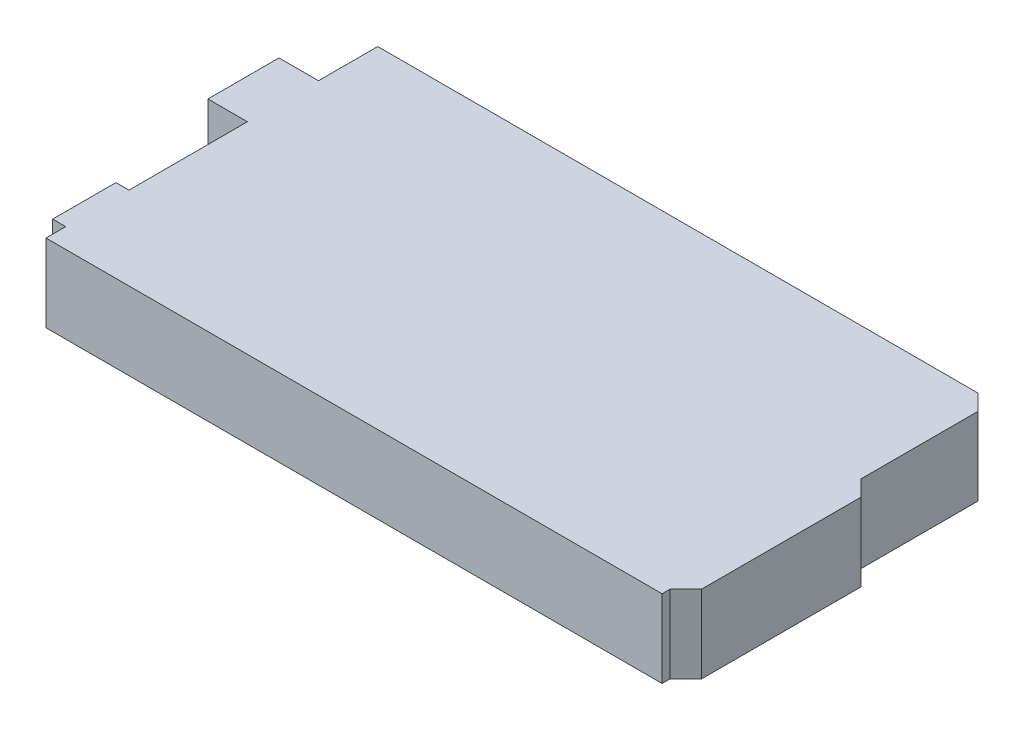
ISO-10303-21;
HEADER;
FILE_DESCRIPTION(('STEP AP214'),'2;1');
FILE_NAME('part.step','',(''),(''),'','','');
FILE_SCHEMA(('AUTOMOTIVE_DESIGN { 1 0 10303 214 1 1 1 1 }'));
ENDSEC;
DATA;
#1=APPLICATION_CONTEXT('core data for automotive mechanical design processes');
#2=APPLICATION_PROTOCOL_DEFINITION('international standard','automotive_design',2000,#1);
#3=PRODUCT_CONTEXT('',#1,'mechanical');
#4=PRODUCT('Part','Part','',(#3));
#5=PRODUCT_RELATED_PRODUCT_CATEGORY('part','',(#4));
#6=PRODUCT_DEFINITION_FORMATION('','',#4);
#7=PRODUCT_DEFINITION_CONTEXT('part definition',#1,'design');
#8=PRODUCT_DEFINITION('design','',#6,#7);
#9=PRODUCT_DEFINITION_SHAPE('','',#8);
#10=(LENGTH_UNIT() NAMED_UNIT(*) SI_UNIT(.MILLI.,.METRE.));
#11=(NAMED_UNIT(*) PLANE_ANGLE_UNIT() SI_UNIT($,.RADIAN.));
#12=(NAMED_UNIT(*) SI_UNIT($,.STERADIAN.) SOLID_ANGLE_UNIT());
#13=UNCERTAINTY_MEASURE_WITH_UNIT(LENGTH_MEASURE(1.E-05),#10,'distance_accuracy_value','');
#14=(GEOMETRIC_REPRESENTATION_CONTEXT(3) GLOBAL_UNCERTAINTY_ASSIGNED_CONTEXT((#13)) GLOBAL_UNIT_ASSIGNED_CONTEXT((#10,
#11,#12)) REPRESENTATION_CONTEXT('',''));
#15=CARTESIAN_POINT('',(0.,0.,0.));
#16=DIRECTION('',(0.,0.,1.));
#17=DIRECTION('',(1.,0.,0.));
#18=AXIS2_PLACEMENT_3D('',#15,#16,#17);
#19=CARTESIAN_POINT('',(-19.7989743589743,12.5,25.5953846153846));
#20=DIRECTION('',(0.,0.,-1.));
#21=DIRECTION('',(-1.,0.,0.));
#22=AXIS2_PLACEMENT_3D('',#19,#20,#21);
#23=PLANE('',#22);
#24=DIRECTION('',(1.,0.,0.));
#25=VECTOR('',#24,1.);
#26=CARTESIAN_POINT('',(-19.7989743589743,0.,25.5953846153846));
#27=LINE('',#26,#25);
#28=CARTESIAN_POINT('',(-118.858974358974,0.,25.5953846153846));
#29=VERTEX_POINT('',#28);
#30=CARTESIAN_POINT('',(-19.7989743589743,0.,25.5953846153846));
#31=VERTEX_POINT('',#30);
#32=EDGE_CURVE('E183',#29,#31,#27,.T.);
#33=ORIENTED_EDGE('',*,*,#32,.T.);
#34=DIRECTION('',(0.,-1.,0.));
#35=VECTOR('',#34,1.);
#36=CARTESIAN_POINT('',(-19.7989743589743,12.5,25.5953846153846));
#37=LINE('',#36,#35);
#38=CARTESIAN_POINT('',(-19.7989743589743,12.5,25.5953846153846));
#39=VERTEX_POINT('',#38);
#40=EDGE_CURVE('E11',#39,#31,#37,.T.);
#41=ORIENTED_EDGE('',*,*,#40,.F.);
#42=DIRECTION('',(1.,0.,0.));
#43=VECTOR('',#42,1.);
#44=CARTESIAN_POINT('',(-19.7989743589743,12.5,25.5953846153846));
#45=LINE('',#44,#43);
#46=CARTESIAN_POINT('',(-118.858974358974,12.5,25.5953846153846));
#47=VERTEX_POINT('',#46);
#48=EDGE_CURVE('E215',#47,#39,#45,.T.);
#49=ORIENTED_EDGE('',*,*,#48,.F.);
#50=DIRECTION('',(0.,-1.,0.));
#51=VECTOR('',#50,1.);
#52=CARTESIAN_POINT('',(-118.858974358974,12.5,25.5953846153846));
#53=LINE('',#52,#51);
#54=EDGE_CURVE('E179',#47,#29,#53,.T.);
#55=ORIENTED_EDGE('',*,*,#54,.T.);
#56=EDGE_LOOP('',(#33,#41,#49,#55));
#57=FACE_BOUND('',#56,.T.);
#58=ADVANCED_FACE('F33',(#57),#23,.F.);
#59=CARTESIAN_POINT('',(-19.7989743589743,12.5,24.3253846153846));
#60=DIRECTION('',(-1.,0.,0.));
#61=DIRECTION('',(0.,0.,1.));
#62=AXIS2_PLACEMENT_3D('',#59,#60,#61);
#63=PLANE('',#62);
#64=DIRECTION('',(0.,0.,-1.));
#65=VECTOR('',#64,1.);
#66=CARTESIAN_POINT('',(-19.7989743589743,0.,24.3253846153846));
#67=LINE('',#66,#65);
#68=CARTESIAN_POINT('',(-19.7989743589743,0.,24.3253846153846));
#69=VERTEX_POINT('',#68);
#70=EDGE_CURVE('E186',#31,#69,#67,.T.);
#71=ORIENTED_EDGE('',*,*,#70,.T.);
#72=DIRECTION('',(0.,-1.,0.));
#73=VECTOR('',#72,1.);
#74=CARTESIAN_POINT('',(-19.7989743589743,12.5,24.3253846153846));
#75=LINE('',#74,#73);
#76=CARTESIAN_POINT('',(-19.7989743589743,12.5,24.3253846153846));
#77=VERTEX_POINT('',#76);
#78=EDGE_CURVE('E41',#77,#69,#75,.T.);
#79=ORIENTED_EDGE('',*,*,#78,.F.);
#80=DIRECTION('',(0.,0.,-1.));
#81=VECTOR('',#80,1.);
#82=CARTESIAN_POINT('',(-19.7989743589743,12.5,24.3253846153846));
#83=LINE('',#82,#81);
#84=EDGE_CURVE('E119',#39,#77,#83,.T.);
#85=ORIENTED_EDGE('',*,*,#84,.F.);
#86=ORIENTED_EDGE('',*,*,#40,.T.);
#87=EDGE_LOOP('',(#71,#79,#85,#86));
#88=FACE_BOUND('',#87,.T.);
#89=ADVANCED_FACE('F318',(#88),#63,.F.);
#90=CARTESIAN_POINT('',(-17.2589743589743,12.5,21.7853846153846));
#91=DIRECTION('',(-0.707106781186547,0.,-0.707106781186547));
#92=DIRECTION('',(-0.707106781186548,0.,0.707106781186548));
#93=AXIS2_PLACEMENT_3D('',#90,#91,#92);
#94=PLANE('',#93);
#95=DIRECTION('',(0.707106781186547,0.,-0.707106781186547));
#96=VECTOR('',#95,1.);
#97=CARTESIAN_POINT('',(-17.2589743589743,0.,21.7853846153846));
#98=LINE('',#97,#96);
#99=CARTESIAN_POINT('',(-17.2589743589743,0.,21.7853846153846));
#100=VERTEX_POINT('',#99);
#101=EDGE_CURVE('E188',#69,#100,#98,.T.);
#102=ORIENTED_EDGE('',*,*,#101,.T.);
#103=DIRECTION('',(0.,-1.,0.));
#104=VECTOR('',#103,1.);
#105=CARTESIAN_POINT('',(-17.2589743589743,12.5,21.7853846153846));
#106=LINE('',#105,#104);
#107=CARTESIAN_POINT('',(-17.2589743589743,12.5,21.7853846153846));
#108=VERTEX_POINT('',#107);
#109=EDGE_CURVE('E249',#108,#100,#106,.T.);
#110=ORIENTED_EDGE('',*,*,#109,.F.);
#111=DIRECTION('',(0.707106781186547,0.,-0.707106781186547));
#112=VECTOR('',#111,1.);
#113=CARTESIAN_POINT('',(-17.2589743589743,12.5,21.7853846153846));
#114=LINE('',#113,#112);
#115=EDGE_CURVE('E257',#77,#108,#114,.T.);
#116=ORIENTED_EDGE('',*,*,#115,.F.);
#117=ORIENTED_EDGE('',*,*,#78,.T.);
#118=EDGE_LOOP('',(#102,#110,#116,#117));
#119=FACE_BOUND('',#118,.T.);
#120=ADVANCED_FACE('F255',(#119),#94,.F.);
#121=CARTESIAN_POINT('',(-17.2589743589743,12.5,-3.8425641025641));
#122=DIRECTION('',(-1.,0.,0.));
#123=DIRECTION('',(0.,0.,1.));
#124=AXIS2_PLACEMENT_3D('',#121,#122,#123);
#125=PLANE('',#124);
#126=DIRECTION('',(0.,0.,-1.));
#127=VECTOR('',#126,1.);
#128=CARTESIAN_POINT('',(-17.2589743589743,0.,-3.8425641025641));
#129=LINE('',#128,#127);
#130=CARTESIAN_POINT('',(-17.2589743589743,0.,-3.8425641025641));
#131=VERTEX_POINT('',#130);
#132=EDGE_CURVE('E190',#100,#131,#129,.T.);
#133=ORIENTED_EDGE('',*,*,#132,.T.);
#134=DIRECTION('',(0.,-1.,0.));
#135=VECTOR('',#134,1.);
#136=CARTESIAN_POINT('',(-17.2589743589743,12.5,-3.8425641025641));
#137=LINE('',#136,#135);
#138=CARTESIAN_POINT('',(-17.2589743589743,12.5,-3.8425641025641));
#139=VERTEX_POINT('',#138);
#140=EDGE_CURVE('E246',#139,#131,#137,.T.);
#141=ORIENTED_EDGE('',*,*,#140,.F.);
#142=DIRECTION('',(0.,0.,-1.));
#143=VECTOR('',#142,1.);
#144=CARTESIAN_POINT('',(-17.2589743589743,12.5,-3.8425641025641));
#145=LINE('',#144,#143);
#146=EDGE_CURVE('E275',#108,#139,#145,.T.);
#147=ORIENTED_EDGE('',*,*,#146,.F.);
#148=ORIENTED_EDGE('',*,*,#109,.T.);
#149=EDGE_LOOP('',(#133,#141,#147,#148));
#150=FACE_BOUND('',#149,.T.);
#151=ADVANCED_FACE('F266',(#150),#125,.F.);
#152=CARTESIAN_POINT('',(-19.7989743589743,12.5,-6.3825641025641));
#153=DIRECTION('',(-0.707106781186547,0.,0.707106781186548));
#154=DIRECTION('',(0.707106781186548,0.,0.707106781186547));
#155=AXIS2_PLACEMENT_3D('',#152,#153,#154);
#156=PLANE('',#155);
#157=DIRECTION('',(-0.707106781186548,0.,-0.707106781186547));
#158=VECTOR('',#157,1.);
#159=CARTESIAN_POINT('',(-19.7989743589743,0.,-6.3825641025641));
#160=LINE('',#159,#158);
#161=CARTESIAN_POINT('',(-19.7989743589743,0.,-6.3825641025641));
#162=VERTEX_POINT('',#161);
#163=EDGE_CURVE('E192',#131,#162,#160,.T.);
#164=ORIENTED_EDGE('',*,*,#163,.T.);
#165=DIRECTION('',(0.,-1.,0.));
#166=VECTOR('',#165,1.);
#167=CARTESIAN_POINT('',(-19.7989743589743,12.5,-6.3825641025641));
#168=LINE('',#167,#166);
#169=CARTESIAN_POINT('',(-19.7989743589743,12.5,-6.3825641025641));
#170=VERTEX_POINT('',#169);
#171=EDGE_CURVE('E243',#170,#162,#168,.T.);
#172=ORIENTED_EDGE('',*,*,#171,.F.);
#173=DIRECTION('',(-0.707106781186548,0.,-0.707106781186547));
#174=VECTOR('',#173,1.);
#175=CARTESIAN_POINT('',(-19.7989743589743,12.5,-6.3825641025641));
#176=LINE('',#175,#174);
#177=EDGE_CURVE('E272',#139,#170,#176,.T.);
#178=ORIENTED_EDGE('',*,*,#177,.F.);
#179=ORIENTED_EDGE('',*,*,#140,.T.);
#180=EDGE_LOOP('',(#164,#172,#178,#179));
#181=FACE_BOUND('',#180,.T.);
#182=ADVANCED_FACE('F270',(#181),#156,.F.);
#183=CARTESIAN_POINT('',(-19.7989743589743,12.5,-25.2046153846154));
#184=DIRECTION('',(-1.,0.,0.));
#185=DIRECTION('',(0.,0.,1.));
#186=AXIS2_PLACEMENT_3D('',#183,#184,#185);
#187=PLANE('',#186);
#188=DIRECTION('',(0.,0.,-1.));
#189=VECTOR('',#188,1.);
#190=CARTESIAN_POINT('',(-19.7989743589743,0.,-25.2046153846154));
#191=LINE('',#190,#189);
#192=CARTESIAN_POINT('',(-19.7989743589743,0.,-25.2046153846154));
#193=VERTEX_POINT('',#192);
#194=EDGE_CURVE('E194',#162,#193,#191,.T.);
#195=ORIENTED_EDGE('',*,*,#194,.T.);
#196=DIRECTION('',(0.,-1.,0.));
#197=VECTOR('',#196,1.);
#198=CARTESIAN_POINT('',(-19.7989743589743,12.5,-25.2046153846154));
#199=LINE('',#198,#197);
#200=CARTESIAN_POINT('',(-19.7989743589743,12.5,-25.2046153846154));
#201=VERTEX_POINT('',#200);
#202=EDGE_CURVE('E240',#201,#193,#199,.T.);
#203=ORIENTED_EDGE('',*,*,#202,.F.);
#204=DIRECTION('',(0.,0.,-1.));
#205=VECTOR('',#204,1.);
#206=CARTESIAN_POINT('',(-19.7989743589743,12.5,-25.2046153846154));
#207=LINE('',#206,#205);
#208=EDGE_CURVE('E274',#170,#201,#207,.T.);
#209=ORIENTED_EDGE('',*,*,#208,.F.);
#210=ORIENTED_EDGE('',*,*,#171,.T.);
#211=EDGE_LOOP('',(#195,#203,#209,#210));
#212=FACE_BOUND('',#211,.T.);
#213=ADVANCED_FACE('F331',(#212),#187,.F.);
#214=CARTESIAN_POINT('',(-22.3389743589743,12.5,-27.7446153846154));
#215=DIRECTION('',(-0.707106781186548,0.,0.707106781186547));
#216=DIRECTION('',(0.707106781186547,0.,0.707106781186548));
#217=AXIS2_PLACEMENT_3D('',#214,#215,#216);
#218=PLANE('',#217);
#219=DIRECTION('',(-0.707106781186547,0.,-0.707106781186548));
#220=VECTOR('',#219,1.);
#221=CARTESIAN_POINT('',(-22.3389743589743,0.,-27.7446153846154));
#222=LINE('',#221,#220);
#223=CARTESIAN_POINT('',(-22.3389743589743,0.,-27.7446153846154));
#224=VERTEX_POINT('',#223);
#225=EDGE_CURVE('E196',#193,#224,#222,.T.);
#226=ORIENTED_EDGE('',*,*,#225,.T.);
#227=DIRECTION('',(0.,-1.,0.));
#228=VECTOR('',#227,1.);
#229=CARTESIAN_POINT('',(-22.3389743589743,12.5,-27.7446153846154));
#230=LINE('',#229,#228);
#231=CARTESIAN_POINT('',(-22.3389743589743,12.5,-27.7446153846154));
#232=VERTEX_POINT('',#231);
#233=EDGE_CURVE('E237',#232,#224,#230,.T.);
#234=ORIENTED_EDGE('',*,*,#233,.F.);
#235=DIRECTION('',(-0.707106781186547,0.,-0.707106781186548));
#236=VECTOR('',#235,1.);
#237=CARTESIAN_POINT('',(-22.3389743589743,12.5,-27.7446153846154));
#238=LINE('',#237,#236);
#239=EDGE_CURVE('E277',#201,#232,#238,.T.);
#240=ORIENTED_EDGE('',*,*,#239,.F.);
#241=ORIENTED_EDGE('',*,*,#202,.T.);
#242=EDGE_LOOP('',(#226,#234,#240,#241));
#243=FACE_BOUND('',#242,.T.);
#244=ADVANCED_FACE('F334',(#243),#218,.F.);
#245=CARTESIAN_POINT('',(-118.858974358974,12.5,-27.7446153846154));
#246=DIRECTION('',(0.,0.,1.));
#247=DIRECTION('',(1.,0.,0.));
#248=AXIS2_PLACEMENT_3D('',#245,#246,#247);
#249=PLANE('',#248);
#250=DIRECTION('',(-1.,0.,0.));
#251=VECTOR('',#250,1.);
#252=CARTESIAN_POINT('',(-118.858974358974,0.,-27.7446153846154));
#253=LINE('',#252,#251);
#254=CARTESIAN_POINT('',(-118.858974358974,0.,-27.7446153846154));
#255=VERTEX_POINT('',#254);
#256=EDGE_CURVE('E198',#224,#255,#253,.T.);
#257=ORIENTED_EDGE('',*,*,#256,.T.);
#258=DIRECTION('',(0.,-1.,0.));
#259=VECTOR('',#258,1.);
#260=CARTESIAN_POINT('',(-118.858974358974,12.5,-27.7446153846154));
#261=LINE('',#260,#259);
#262=CARTESIAN_POINT('',(-118.858974358974,12.5,-27.7446153846154));
#263=VERTEX_POINT('',#262);
#264=EDGE_CURVE('E234',#263,#255,#261,.T.);
#265=ORIENTED_EDGE('',*,*,#264,.F.);
#266=DIRECTION('',(-1.,0.,0.));
#267=VECTOR('',#266,1.);
#268=CARTESIAN_POINT('',(-118.858974358974,12.5,-27.7446153846154));
#269=LINE('',#268,#267);
#270=EDGE_CURVE('E283',#232,#263,#269,.T.);
#271=ORIENTED_EDGE('',*,*,#270,.F.);
#272=ORIENTED_EDGE('',*,*,#233,.T.);
#273=EDGE_LOOP('',(#257,#265,#271,#272));
#274=FACE_BOUND('',#273,.T.);
#275=ADVANCED_FACE('F338',(#274),#249,.F.);
#276=CARTESIAN_POINT('',(-118.858974358974,12.5,-18.2196153846154));
#277=DIRECTION('',(1.,0.,0.));
#278=DIRECTION('',(0.,0.,-1.));
#279=AXIS2_PLACEMENT_3D('',#276,#277,#278);
#280=PLANE('',#279);
#281=DIRECTION('',(0.,0.,1.));
#282=VECTOR('',#281,1.);
#283=CARTESIAN_POINT('',(-118.858974358974,0.,-18.2196153846154));
#284=LINE('',#283,#282);
#285=CARTESIAN_POINT('',(-118.858974358974,0.,-18.2196153846154));
#286=VERTEX_POINT('',#285);
#287=EDGE_CURVE('E200',#255,#286,#284,.T.);
#288=ORIENTED_EDGE('',*,*,#287,.T.);
#289=DIRECTION('',(0.,-1.,0.));
#290=VECTOR('',#289,1.);
#291=CARTESIAN_POINT('',(-118.858974358974,12.5,-18.2196153846154));
#292=LINE('',#291,#290);
#293=CARTESIAN_POINT('',(-118.858974358974,12.5,-18.2196153846154));
#294=VERTEX_POINT('',#293);
#295=EDGE_CURVE('E231',#294,#286,#292,.T.);
#296=ORIENTED_EDGE('',*,*,#295,.F.);
#297=DIRECTION('',(0.,0.,1.));
#298=VECTOR('',#297,1.);
#299=CARTESIAN_POINT('',(-118.858974358974,12.5,-18.2196153846154));
#300=LINE('',#299,#298);
#301=EDGE_CURVE('E285',#263,#294,#300,.T.);
#302=ORIENTED_EDGE('',*,*,#301,.F.);
#303=ORIENTED_EDGE('',*,*,#264,.T.);
#304=EDGE_LOOP('',(#288,#296,#302,#303));
#305=FACE_BOUND('',#304,.T.);
#306=ADVANCED_FACE('F342',(#305),#280,.F.);
#307=CARTESIAN_POINT('',(-118.858974358974,12.5,-18.2196153846154));
#308=DIRECTION('',(0.,0.,1.));
#309=DIRECTION('',(1.,0.,0.));
#310=AXIS2_PLACEMENT_3D('',#307,#308,#309);
#311=PLANE('',#310);
#312=DIRECTION('',(-1.,0.,0.));
#313=VECTOR('',#312,1.);
#314=CARTESIAN_POINT('',(-118.858974358974,0.,-18.2196153846154));
#315=LINE('',#314,#313);
#316=CARTESIAN_POINT('',(-125.208974358974,0.,-18.2196153846154));
#317=VERTEX_POINT('',#316);
#318=EDGE_CURVE('E202',#286,#317,#315,.T.);
#319=ORIENTED_EDGE('',*,*,#318,.T.);
#320=DIRECTION('',(0.,-1.,0.));
#321=VECTOR('',#320,1.);
#322=CARTESIAN_POINT('',(-125.208974358974,12.5,-18.2196153846154));
#323=LINE('',#322,#321);
#324=CARTESIAN_POINT('',(-125.208974358974,12.5,-18.2196153846154));
#325=VERTEX_POINT('',#324);
#326=EDGE_CURVE('E228',#325,#317,#323,.T.);
#327=ORIENTED_EDGE('',*,*,#326,.F.);
#328=DIRECTION('',(-1.,0.,0.));
#329=VECTOR('',#328,1.);
#330=CARTESIAN_POINT('',(-118.858974358974,12.5,-18.2196153846154));
#331=LINE('',#330,#329);
#332=EDGE_CURVE('E287',#294,#325,#331,.T.);
#333=ORIENTED_EDGE('',*,*,#332,.F.);
#334=ORIENTED_EDGE('',*,*,#295,.T.);
#335=EDGE_LOOP('',(#319,#327,#333,#334));
#336=FACE_BOUND('',#335,.T.);
#337=ADVANCED_FACE('F346',(#336),#311,.F.);
#338=CARTESIAN_POINT('',(-125.208974358974,12.5,-18.2196153846154));
#339=DIRECTION('',(1.,0.,0.));
#340=DIRECTION('',(0.,0.,-1.));
#341=AXIS2_PLACEMENT_3D('',#338,#339,#340);
#342=PLANE('',#341);
#343=DIRECTION('',(0.,0.,1.));
#344=VECTOR('',#343,1.);
#345=CARTESIAN_POINT('',(-125.208974358974,0.,-18.2196153846154));
#346=LINE('',#345,#344);
#347=CARTESIAN_POINT('',(-125.208974358974,0.,-6.78961538461537));
#348=VERTEX_POINT('',#347);
#349=EDGE_CURVE('E204',#317,#348,#346,.T.);
#350=ORIENTED_EDGE('',*,*,#349,.T.);
#351=DIRECTION('',(0.,-1.,0.));
#352=VECTOR('',#351,1.);
#353=CARTESIAN_POINT('',(-125.208974358974,12.5,-6.78961538461537));
#354=LINE('',#353,#352);
#355=CARTESIAN_POINT('',(-125.208974358974,12.5,-6.78961538461537));
#356=VERTEX_POINT('',#355);
#357=EDGE_CURVE('E225',#356,#348,#354,.T.);
#358=ORIENTED_EDGE('',*,*,#357,.F.);
#359=DIRECTION('',(0.,0.,1.));
#360=VECTOR('',#359,1.);
#361=CARTESIAN_POINT('',(-125.208974358974,12.5,-18.2196153846154));
#362=LINE('',#361,#360);
#363=EDGE_CURVE('E289',#325,#356,#362,.T.);
#364=ORIENTED_EDGE('',*,*,#363,.F.);
#365=ORIENTED_EDGE('',*,*,#326,.T.);
#366=EDGE_LOOP('',(#350,#358,#364,#365));
#367=FACE_BOUND('',#366,.T.);
#368=ADVANCED_FACE('F350',(#367),#342,.F.);
#369=CARTESIAN_POINT('',(-125.208974358974,12.5,-6.78961538461537));
#370=DIRECTION('',(0.,0.,-1.));
#371=DIRECTION('',(-1.,0.,0.));
#372=AXIS2_PLACEMENT_3D('',#369,#370,#371);
#373=PLANE('',#372);
#374=DIRECTION('',(1.,0.,0.));
#375=VECTOR('',#374,1.);
#376=CARTESIAN_POINT('',(-125.208974358974,0.,-6.78961538461537));
#377=LINE('',#376,#375);
#378=CARTESIAN_POINT('',(-118.858974358974,0.,-6.78961538461537));
#379=VERTEX_POINT('',#378);
#380=EDGE_CURVE('E206',#348,#379,#377,.T.);
#381=ORIENTED_EDGE('',*,*,#380,.T.);
#382=DIRECTION('',(0.,-1.,0.));
#383=VECTOR('',#382,1.);
#384=CARTESIAN_POINT('',(-118.858974358974,12.5,-6.78961538461537));
#385=LINE('',#384,#383);
#386=CARTESIAN_POINT('',(-118.858974358974,12.5,-6.78961538461537));
#387=VERTEX_POINT('',#386);
#388=EDGE_CURVE('E222',#387,#379,#385,.T.);
#389=ORIENTED_EDGE('',*,*,#388,.F.);
#390=DIRECTION('',(1.,0.,0.));
#391=VECTOR('',#390,1.);
#392=CARTESIAN_POINT('',(-125.208974358974,12.5,-6.78961538461537));
#393=LINE('',#392,#391);
#394=EDGE_CURVE('E291',#356,#387,#393,.T.);
#395=ORIENTED_EDGE('',*,*,#394,.F.);
#396=ORIENTED_EDGE('',*,*,#357,.T.);
#397=EDGE_LOOP('',(#381,#389,#395,#396));
#398=FACE_BOUND('',#397,.T.);
#399=ADVANCED_FACE('F354',(#398),#373,.F.);
#400=CARTESIAN_POINT('',(-118.858974358974,12.5,12.2603846153846));
#401=DIRECTION('',(1.,0.,0.));
#402=DIRECTION('',(0.,0.,-1.));
#403=AXIS2_PLACEMENT_3D('',#400,#401,#402);
#404=PLANE('',#403);
#405=DIRECTION('',(0.,0.,1.));
#406=VECTOR('',#405,1.);
#407=CARTESIAN_POINT('',(-118.858974358974,0.,12.2603846153846));
#408=LINE('',#407,#406);
#409=CARTESIAN_POINT('',(-118.858974358974,0.,12.2603846153846));
#410=VERTEX_POINT('',#409);
#411=EDGE_CURVE('E208',#379,#410,#408,.T.);
#412=ORIENTED_EDGE('',*,*,#411,.T.);
#413=DIRECTION('',(0.,-1.,0.));
#414=VECTOR('',#413,1.);
#415=CARTESIAN_POINT('',(-118.858974358974,12.5,12.2603846153846));
#416=LINE('',#415,#414);
#417=CARTESIAN_POINT('',(-118.858974358974,12.5,12.2603846153846));
#418=VERTEX_POINT('',#417);
#419=EDGE_CURVE('E219',#418,#410,#416,.T.);
#420=ORIENTED_EDGE('',*,*,#419,.F.);
#421=DIRECTION('',(0.,0.,1.));
#422=VECTOR('',#421,1.);
#423=CARTESIAN_POINT('',(-118.858974358974,12.5,12.2603846153846));
#424=LINE('',#423,#422);
#425=EDGE_CURVE('E293',#387,#418,#424,.T.);
#426=ORIENTED_EDGE('',*,*,#425,.F.);
#427=ORIENTED_EDGE('',*,*,#388,.T.);
#428=EDGE_LOOP('',(#412,#420,#426,#427));
#429=FACE_BOUND('',#428,.T.);
#430=ADVANCED_FACE('F299',(#429),#404,.F.);
#431=CARTESIAN_POINT('',(-118.858974358974,12.5,12.2603846153846));
#432=DIRECTION('',(0.,0.,1.));
#433=DIRECTION('',(1.,0.,0.));
#434=AXIS2_PLACEMENT_3D('',#431,#432,#433);
#435=PLANE('',#434);
#436=DIRECTION('',(-1.,0.,0.));
#437=VECTOR('',#436,1.);
#438=CARTESIAN_POINT('',(-118.858974358974,0.,12.2603846153846));
#439=LINE('',#438,#437);
#440=CARTESIAN_POINT('',(-120.958974358974,0.,12.2603846153846));
#441=VERTEX_POINT('',#440);
#442=EDGE_CURVE('E210',#410,#441,#439,.T.);
#443=ORIENTED_EDGE('',*,*,#442,.T.);
#444=DIRECTION('',(0.,-1.,0.));
#445=VECTOR('',#444,1.);
#446=CARTESIAN_POINT('',(-120.958974358974,12.5,12.2603846153846));
#447=LINE('',#446,#445);
#448=CARTESIAN_POINT('',(-120.958974358974,12.5,12.2603846153846));
#449=VERTEX_POINT('',#448);
#450=EDGE_CURVE('E174',#449,#441,#447,.T.);
#451=ORIENTED_EDGE('',*,*,#450,.F.);
#452=DIRECTION('',(-1.,0.,0.));
#453=VECTOR('',#452,1.);
#454=CARTESIAN_POINT('',(-118.858974358974,12.5,12.2603846153846));
#455=LINE('',#454,#453);
#456=EDGE_CURVE('E165',#418,#449,#455,.T.);
#457=ORIENTED_EDGE('',*,*,#456,.F.);
#458=ORIENTED_EDGE('',*,*,#419,.T.);
#459=EDGE_LOOP('',(#443,#451,#457,#458));
#460=FACE_BOUND('',#459,.T.);
#461=ADVANCED_FACE('F303',(#460),#435,.F.);
#462=CARTESIAN_POINT('',(-120.958974358974,12.5,12.2603846153846));
#463=DIRECTION('',(1.,0.,0.));
#464=DIRECTION('',(0.,0.,-1.));
#465=AXIS2_PLACEMENT_3D('',#462,#463,#464);
#466=PLANE('',#465);
#467=DIRECTION('',(0.,0.,1.));
#468=VECTOR('',#467,1.);
#469=CARTESIAN_POINT('',(-120.958974358974,0.,12.2603846153846));
#470=LINE('',#469,#468);
#471=CARTESIAN_POINT('',(-120.958974358974,0.,22.4203846153846));
#472=VERTEX_POINT('',#471);
#473=EDGE_CURVE('E173',#441,#472,#470,.T.);
#474=ORIENTED_EDGE('',*,*,#473,.T.);
#475=DIRECTION('',(0.,-1.,0.));
#476=VECTOR('',#475,1.);
#477=CARTESIAN_POINT('',(-120.958974358974,12.5,22.4203846153846));
#478=LINE('',#477,#476);
#479=CARTESIAN_POINT('',(-120.958974358974,12.5,22.4203846153846));
#480=VERTEX_POINT('',#479);
#481=EDGE_CURVE('E170',#480,#472,#478,.T.);
#482=ORIENTED_EDGE('',*,*,#481,.F.);
#483=DIRECTION('',(0.,0.,1.));
#484=VECTOR('',#483,1.);
#485=CARTESIAN_POINT('',(-120.958974358974,12.5,12.2603846153846));
#486=LINE('',#485,#484);
#487=EDGE_CURVE('E159',#449,#480,#486,.T.);
#488=ORIENTED_EDGE('',*,*,#487,.F.);
#489=ORIENTED_EDGE('',*,*,#450,.T.);
#490=EDGE_LOOP('',(#474,#482,#488,#489));
#491=FACE_BOUND('',#490,.T.);
#492=ADVANCED_FACE('F171',(#491),#466,.F.);
#493=CARTESIAN_POINT('',(-120.958974358974,12.5,22.4203846153846));
#494=DIRECTION('',(0.,0.,-1.));
#495=DIRECTION('',(-1.,0.,0.));
#496=AXIS2_PLACEMENT_3D('',#493,#494,#495);
#497=PLANE('',#496);
#498=DIRECTION('',(1.,0.,0.));
#499=VECTOR('',#498,1.);
#500=CARTESIAN_POINT('',(-120.958974358974,0.,22.4203846153846));
#501=LINE('',#500,#499);
#502=CARTESIAN_POINT('',(-118.858974358974,0.,22.4203846153846));
#503=VERTEX_POINT('',#502);
#504=EDGE_CURVE('E105',#472,#503,#501,.T.);
#505=ORIENTED_EDGE('',*,*,#504,.T.);
#506=DIRECTION('',(0.,-1.,0.));
#507=VECTOR('',#506,1.);
#508=CARTESIAN_POINT('',(-118.858974358974,12.5,22.4203846153846));
#509=LINE('',#508,#507);
#510=CARTESIAN_POINT('',(-118.858974358974,12.5,22.4203846153846));
#511=VERTEX_POINT('',#510);
#512=EDGE_CURVE('E175',#511,#503,#509,.T.);
#513=ORIENTED_EDGE('',*,*,#512,.F.);
#514=DIRECTION('',(1.,0.,0.));
#515=VECTOR('',#514,1.);
#516=CARTESIAN_POINT('',(-120.958974358974,12.5,22.4203846153846));
#517=LINE('',#516,#515);
#518=EDGE_CURVE('E163',#480,#511,#517,.T.);
#519=ORIENTED_EDGE('',*,*,#518,.F.);
#520=ORIENTED_EDGE('',*,*,#481,.T.);
#521=EDGE_LOOP('',(#505,#513,#519,#520));
#522=FACE_BOUND('',#521,.T.);
#523=ADVANCED_FACE('F177',(#522),#497,.F.);
#524=CARTESIAN_POINT('',(-118.858974358974,12.5,25.5953846153846));
#525=DIRECTION('',(1.,0.,0.));
#526=DIRECTION('',(0.,0.,-1.));
#527=AXIS2_PLACEMENT_3D('',#524,#525,#526);
#528=PLANE('',#527);
#529=DIRECTION('',(0.,0.,1.));
#530=VECTOR('',#529,1.);
#531=CARTESIAN_POINT('',(-118.858974358974,0.,25.5953846153846));
#532=LINE('',#531,#530);
#533=EDGE_CURVE('E111',#503,#29,#532,.T.);
#534=ORIENTED_EDGE('',*,*,#533,.T.);
#535=ORIENTED_EDGE('',*,*,#54,.F.);
#536=DIRECTION('',(0.,0.,1.));
#537=VECTOR('',#536,1.);
#538=CARTESIAN_POINT('',(-118.858974358974,12.5,25.5953846153846));
#539=LINE('',#538,#537);
#540=EDGE_CURVE('E49',#511,#47,#539,.T.);
#541=ORIENTED_EDGE('',*,*,#540,.F.);
#542=ORIENTED_EDGE('',*,*,#512,.T.);
#543=EDGE_LOOP('',(#534,#535,#541,#542));
#544=FACE_BOUND('',#543,.T.);
#545=ADVANCED_FACE('F307',(#544),#528,.F.);
#546=CARTESIAN_POINT('',(0.,12.5,0.));
#547=DIRECTION('',(0.,-1.,0.));
#548=DIRECTION('',(0.,0.,-1.));
#549=AXIS2_PLACEMENT_3D('',#546,#547,#548);
#550=PLANE('',#549);
#551=ORIENTED_EDGE('',*,*,#48,.T.);
#552=ORIENTED_EDGE('',*,*,#84,.T.);
#553=ORIENTED_EDGE('',*,*,#115,.T.);
#554=ORIENTED_EDGE('',*,*,#146,.T.);
#555=ORIENTED_EDGE('',*,*,#177,.T.);
#556=ORIENTED_EDGE('',*,*,#208,.T.);
#557=ORIENTED_EDGE('',*,*,#239,.T.);
#558=ORIENTED_EDGE('',*,*,#270,.T.);
#559=ORIENTED_EDGE('',*,*,#301,.T.);
#560=ORIENTED_EDGE('',*,*,#332,.T.);
#561=ORIENTED_EDGE('',*,*,#363,.T.);
#562=ORIENTED_EDGE('',*,*,#394,.T.);
#563=ORIENTED_EDGE('',*,*,#425,.T.);
#564=ORIENTED_EDGE('',*,*,#456,.T.);
#565=ORIENTED_EDGE('',*,*,#487,.T.);
#566=ORIENTED_EDGE('',*,*,#518,.T.);
#567=ORIENTED_EDGE('',*,*,#540,.T.);
#568=EDGE_LOOP('',(#551,#552,#553,#554,#555,#556,#557,#558,#559,#560,#561,#562,#563,#564,#565,
#566,#567));
#569=FACE_BOUND('',#568,.T.);
#570=ADVANCED_FACE('F161',(#569),#550,.F.);
#571=CARTESIAN_POINT('',(0.,0.,0.));
#572=DIRECTION('',(0.,-1.,0.));
#573=DIRECTION('',(0.,0.,-1.));
#574=AXIS2_PLACEMENT_3D('',#571,#572,#573);
#575=PLANE('',#574);
#576=ORIENTED_EDGE('',*,*,#32,.F.);
#577=ORIENTED_EDGE('',*,*,#533,.F.);
#578=ORIENTED_EDGE('',*,*,#504,.F.);
#579=ORIENTED_EDGE('',*,*,#473,.F.);
#580=ORIENTED_EDGE('',*,*,#442,.F.);
#581=ORIENTED_EDGE('',*,*,#411,.F.);
#582=ORIENTED_EDGE('',*,*,#380,.F.);
#583=ORIENTED_EDGE('',*,*,#349,.F.);
#584=ORIENTED_EDGE('',*,*,#318,.F.);
#585=ORIENTED_EDGE('',*,*,#287,.F.);
#586=ORIENTED_EDGE('',*,*,#256,.F.);
#587=ORIENTED_EDGE('',*,*,#225,.F.);
#588=ORIENTED_EDGE('',*,*,#194,.F.);
#589=ORIENTED_EDGE('',*,*,#163,.F.);
#590=ORIENTED_EDGE('',*,*,#132,.F.);
#591=ORIENTED_EDGE('',*,*,#101,.F.);
#592=ORIENTED_EDGE('',*,*,#70,.F.);
#593=EDGE_LOOP('',(#576,#577,#578,#579,#580,#581,#582,#583,#584,#585,#586,#587,#588,#589,#590,
#591,#592));
#594=FACE_BOUND('',#593,.T.);
#595=ADVANCED_FACE('F261',(#594),#575,.T.);
#596=CLOSED_SHELL('',(#58,#89,#120,#151,#182,#213,#244,#275,#306,#337,#368,#399,#430,#461,#492,
#523,#545,#570,#595));
#597=MANIFOLD_SOLID_BREP('B2',#596);
#598=ADVANCED_BREP_SHAPE_REPRESENTATION('',(#18,#597),#14);
#599=SHAPE_DEFINITION_REPRESENTATION(#9,#598);
ENDSEC;
END-ISO-10303-21;
